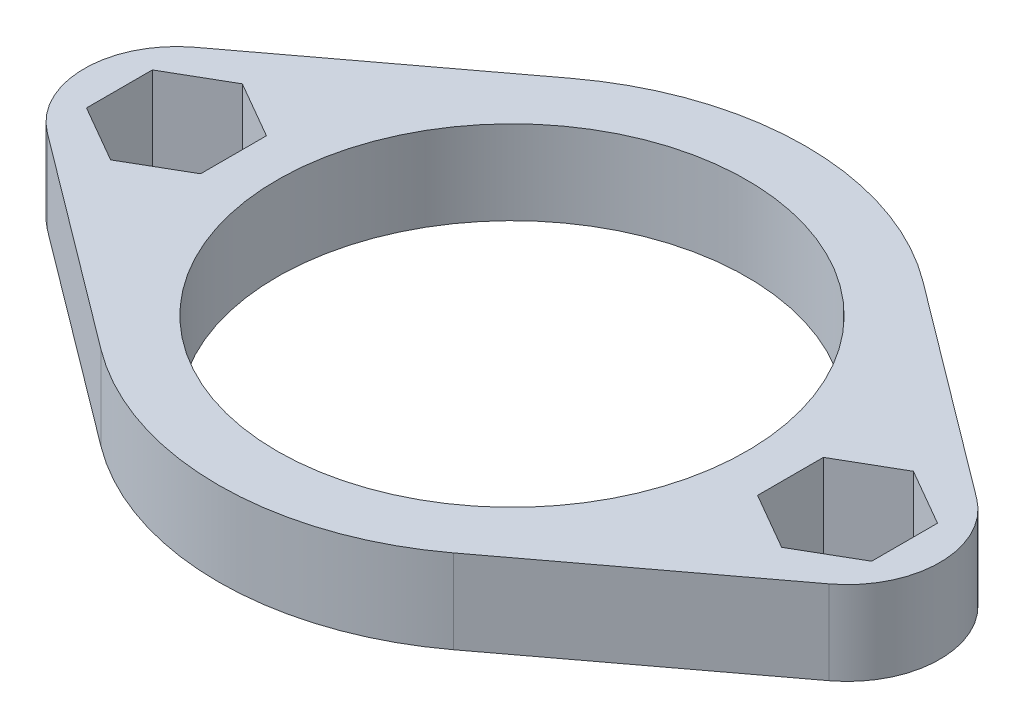
ISO-10303-21;
HEADER;
FILE_DESCRIPTION(('STEP AP214'),'2;1');
FILE_NAME('part.step','',(''),(''),'','','');
FILE_SCHEMA(('AUTOMOTIVE_DESIGN { 1 0 10303 214 1 1 1 1 }'));
ENDSEC;
DATA;
#1=APPLICATION_CONTEXT('core data for automotive mechanical design processes');
#2=APPLICATION_PROTOCOL_DEFINITION('international standard','automotive_design',2000,#1);
#3=PRODUCT_CONTEXT('',#1,'mechanical');
#4=PRODUCT('Part','Part','',(#3));
#5=PRODUCT_RELATED_PRODUCT_CATEGORY('part','',(#4));
#6=PRODUCT_DEFINITION_FORMATION('','',#4);
#7=PRODUCT_DEFINITION_CONTEXT('part definition',#1,'design');
#8=PRODUCT_DEFINITION('design','',#6,#7);
#9=PRODUCT_DEFINITION_SHAPE('','',#8);
#10=(LENGTH_UNIT() NAMED_UNIT(*) SI_UNIT(.MILLI.,.METRE.));
#11=(NAMED_UNIT(*) PLANE_ANGLE_UNIT() SI_UNIT($,.RADIAN.));
#12=(NAMED_UNIT(*) SI_UNIT($,.STERADIAN.) SOLID_ANGLE_UNIT());
#13=UNCERTAINTY_MEASURE_WITH_UNIT(LENGTH_MEASURE(1.E-05),#10,'distance_accuracy_value','');
#14=(GEOMETRIC_REPRESENTATION_CONTEXT(3) GLOBAL_UNCERTAINTY_ASSIGNED_CONTEXT((#13)) GLOBAL_UNIT_ASSIGNED_CONTEXT((#10,
#11,#12)) REPRESENTATION_CONTEXT('',''));
#15=CARTESIAN_POINT('',(0.,0.,0.));
#16=DIRECTION('',(0.,0.,1.));
#17=DIRECTION('',(1.,0.,0.));
#18=AXIS2_PLACEMENT_3D('',#15,#16,#17);
#19=CARTESIAN_POINT('',(-20.,5.,0.));
#20=DIRECTION('',(0.,1.,0.));
#21=DIRECTION('',(0.,0.,1.));
#22=AXIS2_PLACEMENT_3D('',#19,#20,#21);
#23=PLANE('',#22);
#24=DIRECTION('',(-0.866025403784439,0.,0.5));
#25=VECTOR('',#24,1.);
#26=CARTESIAN_POINT('',(-20.,5.,-3.92598183048946));
#27=LINE('',#26,#25);
#28=CARTESIAN_POINT('',(-20.,5.,-3.92598183048946));
#29=VERTEX_POINT('',#28);
#30=CARTESIAN_POINT('',(-23.4,5.,-1.96299091524473));
#31=VERTEX_POINT('',#30);
#32=EDGE_CURVE('E231',#29,#31,#27,.T.);
#33=ORIENTED_EDGE('',*,*,#32,.F.);
#34=DIRECTION('',(-0.866025403784439,0.,-0.5));
#35=VECTOR('',#34,1.);
#36=CARTESIAN_POINT('',(-16.6,5.,-1.96299091524473));
#37=LINE('',#36,#35);
#38=CARTESIAN_POINT('',(-16.6,5.,-1.96299091524473));
#39=VERTEX_POINT('',#38);
#40=EDGE_CURVE('E229',#39,#29,#37,.T.);
#41=ORIENTED_EDGE('',*,*,#40,.F.);
#42=DIRECTION('',(0.,0.,-1.));
#43=VECTOR('',#42,1.);
#44=CARTESIAN_POINT('',(-16.6,5.,1.96299091524473));
#45=LINE('',#44,#43);
#46=CARTESIAN_POINT('',(-16.6,5.,1.96299091524473));
#47=VERTEX_POINT('',#46);
#48=EDGE_CURVE('E241',#47,#39,#45,.T.);
#49=ORIENTED_EDGE('',*,*,#48,.F.);
#50=DIRECTION('',(0.866025403784439,0.,-0.5));
#51=VECTOR('',#50,1.);
#52=CARTESIAN_POINT('',(-20.,5.,3.92598183048945));
#53=LINE('',#52,#51);
#54=CARTESIAN_POINT('',(-20.,5.,3.92598183048945));
#55=VERTEX_POINT('',#54);
#56=EDGE_CURVE('E238',#55,#47,#53,.T.);
#57=ORIENTED_EDGE('',*,*,#56,.F.);
#58=DIRECTION('',(0.866025403784439,0.,0.5));
#59=VECTOR('',#58,1.);
#60=CARTESIAN_POINT('',(-23.4,5.,1.96299091524472));
#61=LINE('',#60,#59);
#62=CARTESIAN_POINT('',(-23.4,5.,1.96299091524472));
#63=VERTEX_POINT('',#62);
#64=EDGE_CURVE('E236',#63,#55,#61,.T.);
#65=ORIENTED_EDGE('',*,*,#64,.F.);
#66=DIRECTION('',(0.,0.,1.));
#67=VECTOR('',#66,1.);
#68=CARTESIAN_POINT('',(-23.4,5.,-1.96299091524473));
#69=LINE('',#68,#67);
#70=EDGE_CURVE('E234',#31,#63,#69,.T.);
#71=ORIENTED_EDGE('',*,*,#70,.F.);
#72=EDGE_LOOP('',(#33,#41,#49,#57,#65,#71));
#73=FACE_BOUND('',#72,.T.);
#74=CARTESIAN_POINT('',(-20.,5.,0.));
#75=DIRECTION('',(0.,1.,0.));
#76=DIRECTION('',(0.,0.,1.));
#77=AXIS2_PLACEMENT_3D('',#74,#75,#76);
#78=CIRCLE('',#77,5.50000000000002);
#79=CARTESIAN_POINT('',(-23.3,5.,-4.40000000000002));
#80=VERTEX_POINT('',#79);
#81=CARTESIAN_POINT('',(-23.3,5.,4.40000000000002));
#82=VERTEX_POINT('',#81);
#83=EDGE_CURVE('E274',#80,#82,#78,.T.);
#84=ORIENTED_EDGE('',*,*,#83,.T.);
#85=DIRECTION('',(0.8,0.,0.599999999999999));
#86=VECTOR('',#85,1.);
#87=CARTESIAN_POINT('',(-23.3,5.,4.40000000000002));
#88=LINE('',#87,#86);
#89=CARTESIAN_POINT('',(-10.5,5.,14.));
#90=VERTEX_POINT('',#89);
#91=EDGE_CURVE('E277',#82,#90,#88,.T.);
#92=ORIENTED_EDGE('',*,*,#91,.T.);
#93=CARTESIAN_POINT('',(0.,5.,0.));
#94=DIRECTION('',(0.,1.,0.));
#95=DIRECTION('',(0.,0.,1.));
#96=AXIS2_PLACEMENT_3D('',#93,#94,#95);
#97=CIRCLE('',#96,17.5);
#98=CARTESIAN_POINT('',(10.5,5.,14.));
#99=VERTEX_POINT('',#98);
#100=EDGE_CURVE('E280',#90,#99,#97,.T.);
#101=ORIENTED_EDGE('',*,*,#100,.T.);
#102=DIRECTION('',(0.8,0.,-0.599999999999999));
#103=VECTOR('',#102,1.);
#104=CARTESIAN_POINT('',(23.3,5.,4.40000000000002));
#105=LINE('',#104,#103);
#106=CARTESIAN_POINT('',(23.3,5.,4.40000000000002));
#107=VERTEX_POINT('',#106);
#108=EDGE_CURVE('E282',#99,#107,#105,.T.);
#109=ORIENTED_EDGE('',*,*,#108,.T.);
#110=CARTESIAN_POINT('',(20.,5.,0.));
#111=DIRECTION('',(0.,1.,0.));
#112=DIRECTION('',(0.,0.,-1.));
#113=AXIS2_PLACEMENT_3D('',#110,#111,#112);
#114=CIRCLE('',#113,5.50000000000002);
#115=CARTESIAN_POINT('',(23.3,5.,-4.40000000000002));
#116=VERTEX_POINT('',#115);
#117=EDGE_CURVE('E284',#107,#116,#114,.T.);
#118=ORIENTED_EDGE('',*,*,#117,.T.);
#119=DIRECTION('',(-0.8,0.,-0.599999999999999));
#120=VECTOR('',#119,1.);
#121=CARTESIAN_POINT('',(23.3,5.,-4.40000000000002));
#122=LINE('',#121,#120);
#123=CARTESIAN_POINT('',(10.5,5.,-14.));
#124=VERTEX_POINT('',#123);
#125=EDGE_CURVE('E286',#116,#124,#122,.T.);
#126=ORIENTED_EDGE('',*,*,#125,.T.);
#127=CARTESIAN_POINT('',(0.,5.,0.));
#128=DIRECTION('',(0.,1.,0.));
#129=DIRECTION('',(0.,0.,1.));
#130=AXIS2_PLACEMENT_3D('',#127,#128,#129);
#131=CIRCLE('',#130,17.5);
#132=CARTESIAN_POINT('',(-10.5,5.,-14.));
#133=VERTEX_POINT('',#132);
#134=EDGE_CURVE('E288',#124,#133,#131,.T.);
#135=ORIENTED_EDGE('',*,*,#134,.T.);
#136=DIRECTION('',(-0.8,0.,0.599999999999999));
#137=VECTOR('',#136,1.);
#138=CARTESIAN_POINT('',(-23.3,5.,-4.40000000000002));
#139=LINE('',#138,#137);
#140=EDGE_CURVE('E290',#133,#80,#139,.T.);
#141=ORIENTED_EDGE('',*,*,#140,.T.);
#142=EDGE_LOOP('',(#84,#92,#101,#109,#118,#126,#135,#141));
#143=FACE_BOUND('',#142,.T.);
#144=CARTESIAN_POINT('',(0.,5.,0.));
#145=DIRECTION('',(0.,1.,0.));
#146=DIRECTION('',(0.,0.,1.));
#147=AXIS2_PLACEMENT_3D('',#144,#145,#146);
#148=CIRCLE('',#147,14.);
#149=CARTESIAN_POINT('',(0.,5.,14.));
#150=VERTEX_POINT('',#149);
#151=EDGE_CURVE('E223',#150,#150,#148,.T.);
#152=ORIENTED_EDGE('',*,*,#151,.F.);
#153=EDGE_LOOP('',(#152));
#154=FACE_BOUND('',#153,.T.);
#155=DIRECTION('',(0.866025403784438,0.,-0.5));
#156=VECTOR('',#155,1.);
#157=CARTESIAN_POINT('',(20.,5.,3.92598183048946));
#158=LINE('',#157,#156);
#159=CARTESIAN_POINT('',(20.,5.,3.92598183048946));
#160=VERTEX_POINT('',#159);
#161=CARTESIAN_POINT('',(23.4,5.,1.96299091524472));
#162=VERTEX_POINT('',#161);
#163=EDGE_CURVE('E180',#160,#162,#158,.T.);
#164=ORIENTED_EDGE('',*,*,#163,.F.);
#165=DIRECTION('',(0.866025403784439,0.,0.5));
#166=VECTOR('',#165,1.);
#167=CARTESIAN_POINT('',(16.6,5.,1.96299091524475));
#168=LINE('',#167,#166);
#169=CARTESIAN_POINT('',(16.6,5.,1.96299091524475));
#170=VERTEX_POINT('',#169);
#171=EDGE_CURVE('E172',#170,#160,#168,.T.);
#172=ORIENTED_EDGE('',*,*,#171,.F.);
#173=DIRECTION('',(0.,0.,1.));
#174=VECTOR('',#173,1.);
#175=CARTESIAN_POINT('',(16.6,5.,-1.9629909152447));
#176=LINE('',#175,#174);
#177=CARTESIAN_POINT('',(16.6,5.,-1.9629909152447));
#178=VERTEX_POINT('',#177);
#179=EDGE_CURVE('E201',#178,#170,#176,.T.);
#180=ORIENTED_EDGE('',*,*,#179,.F.);
#181=DIRECTION('',(-0.866025403784435,0.,0.500000000000007));
#182=VECTOR('',#181,1.);
#183=CARTESIAN_POINT('',(20.,5.,-3.92598183048946));
#184=LINE('',#183,#182);
#185=CARTESIAN_POINT('',(20.,5.,-3.92598183048946));
#186=VERTEX_POINT('',#185);
#187=EDGE_CURVE('E199',#186,#178,#184,.T.);
#188=ORIENTED_EDGE('',*,*,#187,.F.);
#189=DIRECTION('',(-0.866025403784439,0.,-0.5));
#190=VECTOR('',#189,1.);
#191=CARTESIAN_POINT('',(23.4,5.,-1.96299091524473));
#192=LINE('',#191,#190);
#193=CARTESIAN_POINT('',(23.4,5.,-1.96299091524473));
#194=VERTEX_POINT('',#193);
#195=EDGE_CURVE('E195',#194,#186,#192,.T.);
#196=ORIENTED_EDGE('',*,*,#195,.F.);
#197=DIRECTION('',(0.,0.,-1.));
#198=VECTOR('',#197,1.);
#199=CARTESIAN_POINT('',(23.4,5.,1.96299091524472));
#200=LINE('',#199,#198);
#201=EDGE_CURVE('E193',#162,#194,#200,.T.);
#202=ORIENTED_EDGE('',*,*,#201,.F.);
#203=EDGE_LOOP('',(#164,#172,#180,#188,#196,#202));
#204=FACE_BOUND('',#203,.T.);
#205=ADVANCED_FACE('F35',(#73,#143,#154,#204),#23,.T.);
#206=CARTESIAN_POINT('',(-20.,0.,0.));
#207=DIRECTION('',(0.,1.,0.));
#208=DIRECTION('',(0.,0.,1.));
#209=AXIS2_PLACEMENT_3D('',#206,#207,#208);
#210=PLANE('',#209);
#211=CARTESIAN_POINT('',(0.,0.,0.));
#212=DIRECTION('',(0.,1.,0.));
#213=DIRECTION('',(0.,0.,1.));
#214=AXIS2_PLACEMENT_3D('',#211,#212,#213);
#215=CIRCLE('',#214,14.);
#216=CARTESIAN_POINT('',(0.,0.,14.));
#217=VERTEX_POINT('',#216);
#218=EDGE_CURVE('E188',#217,#217,#215,.T.);
#219=ORIENTED_EDGE('',*,*,#218,.T.);
#220=EDGE_LOOP('',(#219));
#221=FACE_BOUND('',#220,.T.);
#222=DIRECTION('',(-0.866025403784439,0.,-0.5));
#223=VECTOR('',#222,1.);
#224=CARTESIAN_POINT('',(-16.6,0.,-1.96299091524473));
#225=LINE('',#224,#223);
#226=CARTESIAN_POINT('',(-16.6,0.,-1.96299091524473));
#227=VERTEX_POINT('',#226);
#228=CARTESIAN_POINT('',(-20.,0.,-3.92598183048946));
#229=VERTEX_POINT('',#228);
#230=EDGE_CURVE('E226',#227,#229,#225,.T.);
#231=ORIENTED_EDGE('',*,*,#230,.T.);
#232=DIRECTION('',(-0.866025403784439,0.,0.5));
#233=VECTOR('',#232,1.);
#234=CARTESIAN_POINT('',(-20.,0.,-3.92598183048946));
#235=LINE('',#234,#233);
#236=CARTESIAN_POINT('',(-23.4,0.,-1.96299091524473));
#237=VERTEX_POINT('',#236);
#238=EDGE_CURVE('E246',#229,#237,#235,.T.);
#239=ORIENTED_EDGE('',*,*,#238,.T.);
#240=DIRECTION('',(0.,0.,1.));
#241=VECTOR('',#240,1.);
#242=CARTESIAN_POINT('',(-23.4,0.,-1.96299091524473));
#243=LINE('',#242,#241);
#244=CARTESIAN_POINT('',(-23.4,0.,1.96299091524472));
#245=VERTEX_POINT('',#244);
#246=EDGE_CURVE('E249',#237,#245,#243,.T.);
#247=ORIENTED_EDGE('',*,*,#246,.T.);
#248=DIRECTION('',(0.866025403784439,0.,0.5));
#249=VECTOR('',#248,1.);
#250=CARTESIAN_POINT('',(-23.4,0.,1.96299091524472));
#251=LINE('',#250,#249);
#252=CARTESIAN_POINT('',(-20.,0.,3.92598183048945));
#253=VERTEX_POINT('',#252);
#254=EDGE_CURVE('E252',#245,#253,#251,.T.);
#255=ORIENTED_EDGE('',*,*,#254,.T.);
#256=DIRECTION('',(0.866025403784439,0.,-0.5));
#257=VECTOR('',#256,1.);
#258=CARTESIAN_POINT('',(-20.,0.,3.92598183048945));
#259=LINE('',#258,#257);
#260=CARTESIAN_POINT('',(-16.6,0.,1.96299091524473));
#261=VERTEX_POINT('',#260);
#262=EDGE_CURVE('E255',#253,#261,#259,.T.);
#263=ORIENTED_EDGE('',*,*,#262,.T.);
#264=DIRECTION('',(0.,0.,-1.));
#265=VECTOR('',#264,1.);
#266=CARTESIAN_POINT('',(-16.6,0.,1.96299091524473));
#267=LINE('',#266,#265);
#268=EDGE_CURVE('E232',#261,#227,#267,.T.);
#269=ORIENTED_EDGE('',*,*,#268,.T.);
#270=EDGE_LOOP('',(#231,#239,#247,#255,#263,#269));
#271=FACE_BOUND('',#270,.T.);
#272=CARTESIAN_POINT('',(-20.,0.,0.));
#273=DIRECTION('',(0.,1.,0.));
#274=DIRECTION('',(0.,0.,1.));
#275=AXIS2_PLACEMENT_3D('',#272,#273,#274);
#276=CIRCLE('',#275,5.50000000000002);
#277=CARTESIAN_POINT('',(-23.3,0.,-4.40000000000002));
#278=VERTEX_POINT('',#277);
#279=CARTESIAN_POINT('',(-23.3,0.,4.40000000000002));
#280=VERTEX_POINT('',#279);
#281=EDGE_CURVE('E273',#278,#280,#276,.T.);
#282=ORIENTED_EDGE('',*,*,#281,.F.);
#283=DIRECTION('',(-0.8,0.,0.599999999999999));
#284=VECTOR('',#283,1.);
#285=CARTESIAN_POINT('',(-23.3,0.,-4.40000000000002));
#286=LINE('',#285,#284);
#287=CARTESIAN_POINT('',(-10.5,0.,-14.));
#288=VERTEX_POINT('',#287);
#289=EDGE_CURVE('E278',#288,#278,#286,.T.);
#290=ORIENTED_EDGE('',*,*,#289,.F.);
#291=CARTESIAN_POINT('',(0.,0.,0.));
#292=DIRECTION('',(0.,1.,0.));
#293=DIRECTION('',(0.,0.,1.));
#294=AXIS2_PLACEMENT_3D('',#291,#292,#293);
#295=CIRCLE('',#294,17.5);
#296=CARTESIAN_POINT('',(10.5,0.,-14.));
#297=VERTEX_POINT('',#296);
#298=EDGE_CURVE('E305',#297,#288,#295,.T.);
#299=ORIENTED_EDGE('',*,*,#298,.F.);
#300=DIRECTION('',(-0.8,0.,-0.599999999999999));
#301=VECTOR('',#300,1.);
#302=CARTESIAN_POINT('',(23.3,0.,-4.40000000000002));
#303=LINE('',#302,#301);
#304=CARTESIAN_POINT('',(23.3,0.,-4.40000000000002));
#305=VERTEX_POINT('',#304);
#306=EDGE_CURVE('E303',#305,#297,#303,.T.);
#307=ORIENTED_EDGE('',*,*,#306,.F.);
#308=CARTESIAN_POINT('',(20.,0.,0.));
#309=DIRECTION('',(0.,1.,0.));
#310=DIRECTION('',(0.,0.,-1.));
#311=AXIS2_PLACEMENT_3D('',#308,#309,#310);
#312=CIRCLE('',#311,5.50000000000002);
#313=CARTESIAN_POINT('',(23.3,0.,4.40000000000002));
#314=VERTEX_POINT('',#313);
#315=EDGE_CURVE('E301',#314,#305,#312,.T.);
#316=ORIENTED_EDGE('',*,*,#315,.F.);
#317=DIRECTION('',(0.8,0.,-0.599999999999999));
#318=VECTOR('',#317,1.);
#319=CARTESIAN_POINT('',(23.3,0.,4.40000000000002));
#320=LINE('',#319,#318);
#321=CARTESIAN_POINT('',(10.5,0.,14.));
#322=VERTEX_POINT('',#321);
#323=EDGE_CURVE('E299',#322,#314,#320,.T.);
#324=ORIENTED_EDGE('',*,*,#323,.F.);
#325=CARTESIAN_POINT('',(0.,0.,0.));
#326=DIRECTION('',(0.,1.,0.));
#327=DIRECTION('',(0.,0.,1.));
#328=AXIS2_PLACEMENT_3D('',#325,#326,#327);
#329=CIRCLE('',#328,17.5);
#330=CARTESIAN_POINT('',(-10.5,0.,14.));
#331=VERTEX_POINT('',#330);
#332=EDGE_CURVE('E297',#331,#322,#329,.T.);
#333=ORIENTED_EDGE('',*,*,#332,.F.);
#334=DIRECTION('',(0.8,0.,0.599999999999999));
#335=VECTOR('',#334,1.);
#336=CARTESIAN_POINT('',(-23.3,0.,4.40000000000002));
#337=LINE('',#336,#335);
#338=EDGE_CURVE('E295',#280,#331,#337,.T.);
#339=ORIENTED_EDGE('',*,*,#338,.F.);
#340=EDGE_LOOP('',(#282,#290,#299,#307,#316,#324,#333,#339));
#341=FACE_BOUND('',#340,.T.);
#342=DIRECTION('',(0.866025403784439,0.,0.5));
#343=VECTOR('',#342,1.);
#344=CARTESIAN_POINT('',(16.6,0.,1.96299091524475));
#345=LINE('',#344,#343);
#346=CARTESIAN_POINT('',(16.6,0.,1.96299091524475));
#347=VERTEX_POINT('',#346);
#348=CARTESIAN_POINT('',(20.,0.,3.92598183048946));
#349=VERTEX_POINT('',#348);
#350=EDGE_CURVE('E58',#347,#349,#345,.T.);
#351=ORIENTED_EDGE('',*,*,#350,.T.);
#352=DIRECTION('',(0.866025403784438,0.,-0.5));
#353=VECTOR('',#352,1.);
#354=CARTESIAN_POINT('',(20.,0.,3.92598183048946));
#355=LINE('',#354,#353);
#356=CARTESIAN_POINT('',(23.4,0.,1.96299091524472));
#357=VERTEX_POINT('',#356);
#358=EDGE_CURVE('E187',#349,#357,#355,.T.);
#359=ORIENTED_EDGE('',*,*,#358,.T.);
#360=DIRECTION('',(0.,0.,-1.));
#361=VECTOR('',#360,1.);
#362=CARTESIAN_POINT('',(23.4,0.,1.96299091524472));
#363=LINE('',#362,#361);
#364=CARTESIAN_POINT('',(23.4,0.,-1.96299091524473));
#365=VERTEX_POINT('',#364);
#366=EDGE_CURVE('E205',#357,#365,#363,.T.);
#367=ORIENTED_EDGE('',*,*,#366,.T.);
#368=DIRECTION('',(-0.866025403784439,0.,-0.5));
#369=VECTOR('',#368,1.);
#370=CARTESIAN_POINT('',(23.4,0.,-1.96299091524473));
#371=LINE('',#370,#369);
#372=CARTESIAN_POINT('',(20.,0.,-3.92598183048946));
#373=VERTEX_POINT('',#372);
#374=EDGE_CURVE('E208',#365,#373,#371,.T.);
#375=ORIENTED_EDGE('',*,*,#374,.T.);
#376=DIRECTION('',(-0.866025403784435,0.,0.500000000000007));
#377=VECTOR('',#376,1.);
#378=CARTESIAN_POINT('',(20.,0.,-3.92598183048946));
#379=LINE('',#378,#377);
#380=CARTESIAN_POINT('',(16.6,0.,-1.9629909152447));
#381=VERTEX_POINT('',#380);
#382=EDGE_CURVE('E211',#373,#381,#379,.T.);
#383=ORIENTED_EDGE('',*,*,#382,.T.);
#384=DIRECTION('',(0.,0.,1.));
#385=VECTOR('',#384,1.);
#386=CARTESIAN_POINT('',(16.6,0.,-1.9629909152447));
#387=LINE('',#386,#385);
#388=EDGE_CURVE('E181',#381,#347,#387,.T.);
#389=ORIENTED_EDGE('',*,*,#388,.T.);
#390=EDGE_LOOP('',(#351,#359,#367,#375,#383,#389));
#391=FACE_BOUND('',#390,.T.);
#392=ADVANCED_FACE('F335',(#221,#271,#341,#391),#210,.F.);
#393=CARTESIAN_POINT('',(-20.,5.,0.));
#394=DIRECTION('',(0.,-1.,0.));
#395=DIRECTION('',(0.,0.,-1.));
#396=AXIS2_PLACEMENT_3D('',#393,#394,#395);
#397=CYLINDRICAL_SURFACE('',#396,5.50000000000002);
#398=ORIENTED_EDGE('',*,*,#281,.T.);
#399=DIRECTION('',(0.,-1.,0.));
#400=VECTOR('',#399,1.);
#401=CARTESIAN_POINT('',(-23.3,5.,4.40000000000002));
#402=LINE('',#401,#400);
#403=EDGE_CURVE('E11',#82,#280,#402,.T.);
#404=ORIENTED_EDGE('',*,*,#403,.F.);
#405=ORIENTED_EDGE('',*,*,#83,.F.);
#406=DIRECTION('',(0.,-1.,0.));
#407=VECTOR('',#406,1.);
#408=CARTESIAN_POINT('',(-23.3,5.,-4.40000000000002));
#409=LINE('',#408,#407);
#410=EDGE_CURVE('E292',#80,#278,#409,.T.);
#411=ORIENTED_EDGE('',*,*,#410,.T.);
#412=EDGE_LOOP('',(#398,#404,#405,#411));
#413=FACE_BOUND('',#412,.T.);
#414=ADVANCED_FACE('F37',(#413),#397,.T.);
#415=CARTESIAN_POINT('',(-23.3,5.,4.40000000000002));
#416=DIRECTION('',(0.599999999999999,0.,-0.8));
#417=DIRECTION('',(-0.800000000000001,0.,-0.599999999999999));
#418=AXIS2_PLACEMENT_3D('',#415,#416,#417);
#419=PLANE('',#418);
#420=ORIENTED_EDGE('',*,*,#338,.T.);
#421=DIRECTION('',(0.,-1.,0.));
#422=VECTOR('',#421,1.);
#423=CARTESIAN_POINT('',(-10.5,5.,14.));
#424=LINE('',#423,#422);
#425=EDGE_CURVE('E43',#90,#331,#424,.T.);
#426=ORIENTED_EDGE('',*,*,#425,.F.);
#427=ORIENTED_EDGE('',*,*,#91,.F.);
#428=ORIENTED_EDGE('',*,*,#403,.T.);
#429=EDGE_LOOP('',(#420,#426,#427,#428));
#430=FACE_BOUND('',#429,.T.);
#431=ADVANCED_FACE('F353',(#430),#419,.F.);
#432=CARTESIAN_POINT('',(0.,5.,0.));
#433=DIRECTION('',(0.,-1.,0.));
#434=DIRECTION('',(0.,0.,-1.));
#435=AXIS2_PLACEMENT_3D('',#432,#433,#434);
#436=CYLINDRICAL_SURFACE('',#435,17.5);
#437=ORIENTED_EDGE('',*,*,#332,.T.);
#438=DIRECTION('',(0.,-1.,0.));
#439=VECTOR('',#438,1.);
#440=CARTESIAN_POINT('',(10.5,5.,14.));
#441=LINE('',#440,#439);
#442=EDGE_CURVE('E322',#99,#322,#441,.T.);
#443=ORIENTED_EDGE('',*,*,#442,.F.);
#444=ORIENTED_EDGE('',*,*,#100,.F.);
#445=ORIENTED_EDGE('',*,*,#425,.T.);
#446=EDGE_LOOP('',(#437,#443,#444,#445));
#447=FACE_BOUND('',#446,.T.);
#448=ADVANCED_FACE('F329',(#447),#436,.T.);
#449=CARTESIAN_POINT('',(23.3,5.,4.40000000000002));
#450=DIRECTION('',(-0.599999999999999,0.,-0.8));
#451=DIRECTION('',(-0.800000000000001,0.,0.599999999999999));
#452=AXIS2_PLACEMENT_3D('',#449,#450,#451);
#453=PLANE('',#452);
#454=ORIENTED_EDGE('',*,*,#323,.T.);
#455=DIRECTION('',(0.,-1.,0.));
#456=VECTOR('',#455,1.);
#457=CARTESIAN_POINT('',(23.3,5.,4.40000000000002));
#458=LINE('',#457,#456);
#459=EDGE_CURVE('E319',#107,#314,#458,.T.);
#460=ORIENTED_EDGE('',*,*,#459,.F.);
#461=ORIENTED_EDGE('',*,*,#108,.F.);
#462=ORIENTED_EDGE('',*,*,#442,.T.);
#463=EDGE_LOOP('',(#454,#460,#461,#462));
#464=FACE_BOUND('',#463,.T.);
#465=ADVANCED_FACE('F341',(#464),#453,.F.);
#466=CARTESIAN_POINT('',(20.,5.,0.));
#467=DIRECTION('',(0.,-1.,0.));
#468=DIRECTION('',(0.,0.,-1.));
#469=AXIS2_PLACEMENT_3D('',#466,#467,#468);
#470=CYLINDRICAL_SURFACE('',#469,5.50000000000002);
#471=ORIENTED_EDGE('',*,*,#315,.T.);
#472=DIRECTION('',(0.,-1.,0.));
#473=VECTOR('',#472,1.);
#474=CARTESIAN_POINT('',(23.3,5.,-4.40000000000002));
#475=LINE('',#474,#473);
#476=EDGE_CURVE('E316',#116,#305,#475,.T.);
#477=ORIENTED_EDGE('',*,*,#476,.F.);
#478=ORIENTED_EDGE('',*,*,#117,.F.);
#479=ORIENTED_EDGE('',*,*,#459,.T.);
#480=EDGE_LOOP('',(#471,#477,#478,#479));
#481=FACE_BOUND('',#480,.T.);
#482=ADVANCED_FACE('F345',(#481),#470,.T.);
#483=CARTESIAN_POINT('',(23.3,5.,-4.40000000000002));
#484=DIRECTION('',(-0.599999999999999,0.,0.8));
#485=DIRECTION('',(0.800000000000001,0.,0.599999999999999));
#486=AXIS2_PLACEMENT_3D('',#483,#484,#485);
#487=PLANE('',#486);
#488=ORIENTED_EDGE('',*,*,#306,.T.);
#489=DIRECTION('',(0.,-1.,0.));
#490=VECTOR('',#489,1.);
#491=CARTESIAN_POINT('',(10.5,5.,-14.));
#492=LINE('',#491,#490);
#493=EDGE_CURVE('E313',#124,#297,#492,.T.);
#494=ORIENTED_EDGE('',*,*,#493,.F.);
#495=ORIENTED_EDGE('',*,*,#125,.F.);
#496=ORIENTED_EDGE('',*,*,#476,.T.);
#497=EDGE_LOOP('',(#488,#494,#495,#496));
#498=FACE_BOUND('',#497,.T.);
#499=ADVANCED_FACE('F366',(#498),#487,.F.);
#500=CARTESIAN_POINT('',(0.,5.,0.));
#501=DIRECTION('',(0.,-1.,0.));
#502=DIRECTION('',(0.,0.,-1.));
#503=AXIS2_PLACEMENT_3D('',#500,#501,#502);
#504=CYLINDRICAL_SURFACE('',#503,17.5);
#505=ORIENTED_EDGE('',*,*,#298,.T.);
#506=DIRECTION('',(0.,-1.,0.));
#507=VECTOR('',#506,1.);
#508=CARTESIAN_POINT('',(-10.5,5.,-14.));
#509=LINE('',#508,#507);
#510=EDGE_CURVE('E310',#133,#288,#509,.T.);
#511=ORIENTED_EDGE('',*,*,#510,.F.);
#512=ORIENTED_EDGE('',*,*,#134,.F.);
#513=ORIENTED_EDGE('',*,*,#493,.T.);
#514=EDGE_LOOP('',(#505,#511,#512,#513));
#515=FACE_BOUND('',#514,.T.);
#516=ADVANCED_FACE('F364',(#515),#504,.T.);
#517=CARTESIAN_POINT('',(-23.3,5.,-4.40000000000002));
#518=DIRECTION('',(0.599999999999999,0.,0.8));
#519=DIRECTION('',(0.800000000000001,0.,-0.599999999999999));
#520=AXIS2_PLACEMENT_3D('',#517,#518,#519);
#521=PLANE('',#520);
#522=ORIENTED_EDGE('',*,*,#289,.T.);
#523=ORIENTED_EDGE('',*,*,#410,.F.);
#524=ORIENTED_EDGE('',*,*,#140,.F.);
#525=ORIENTED_EDGE('',*,*,#510,.T.);
#526=EDGE_LOOP('',(#522,#523,#524,#525));
#527=FACE_BOUND('',#526,.T.);
#528=ADVANCED_FACE('F359',(#527),#521,.F.);
#529=CARTESIAN_POINT('',(-16.6,5.,-1.96299091524473));
#530=DIRECTION('',(-0.5,0.,0.866025403784438));
#531=DIRECTION('',(0.866025403784439,0.,0.5));
#532=AXIS2_PLACEMENT_3D('',#529,#530,#531);
#533=PLANE('',#532);
#534=ORIENTED_EDGE('',*,*,#230,.F.);
#535=DIRECTION('',(0.,-1.,0.));
#536=VECTOR('',#535,1.);
#537=CARTESIAN_POINT('',(-16.6,5.,-1.96299091524473));
#538=LINE('',#537,#536);
#539=EDGE_CURVE('E243',#39,#227,#538,.T.);
#540=ORIENTED_EDGE('',*,*,#539,.F.);
#541=ORIENTED_EDGE('',*,*,#40,.T.);
#542=DIRECTION('',(0.,-1.,0.));
#543=VECTOR('',#542,1.);
#544=CARTESIAN_POINT('',(-20.,5.,-3.92598183048946));
#545=LINE('',#544,#543);
#546=EDGE_CURVE('E270',#29,#229,#545,.T.);
#547=ORIENTED_EDGE('',*,*,#546,.T.);
#548=EDGE_LOOP('',(#534,#540,#541,#547));
#549=FACE_BOUND('',#548,.T.);
#550=ADVANCED_FACE('F385',(#549),#533,.T.);
#551=CARTESIAN_POINT('',(-20.,5.,-3.92598183048946));
#552=DIRECTION('',(0.5,0.,0.866025403784439));
#553=DIRECTION('',(0.866025403784439,0.,-0.5));
#554=AXIS2_PLACEMENT_3D('',#551,#552,#553);
#555=PLANE('',#554);
#556=ORIENTED_EDGE('',*,*,#238,.F.);
#557=ORIENTED_EDGE('',*,*,#546,.F.);
#558=ORIENTED_EDGE('',*,*,#32,.T.);
#559=DIRECTION('',(0.,-1.,0.));
#560=VECTOR('',#559,1.);
#561=CARTESIAN_POINT('',(-23.4,5.,-1.96299091524473));
#562=LINE('',#561,#560);
#563=EDGE_CURVE('E268',#31,#237,#562,.T.);
#564=ORIENTED_EDGE('',*,*,#563,.T.);
#565=EDGE_LOOP('',(#556,#557,#558,#564));
#566=FACE_BOUND('',#565,.T.);
#567=ADVANCED_FACE('F392',(#566),#555,.T.);
#568=CARTESIAN_POINT('',(-23.4,5.,-1.96299091524473));
#569=DIRECTION('',(1.,0.,0.));
#570=DIRECTION('',(0.,0.,-1.));
#571=AXIS2_PLACEMENT_3D('',#568,#569,#570);
#572=PLANE('',#571);
#573=ORIENTED_EDGE('',*,*,#246,.F.);
#574=ORIENTED_EDGE('',*,*,#563,.F.);
#575=ORIENTED_EDGE('',*,*,#70,.T.);
#576=DIRECTION('',(0.,-1.,0.));
#577=VECTOR('',#576,1.);
#578=CARTESIAN_POINT('',(-23.4,5.,1.96299091524472));
#579=LINE('',#578,#577);
#580=EDGE_CURVE('E266',#63,#245,#579,.T.);
#581=ORIENTED_EDGE('',*,*,#580,.T.);
#582=EDGE_LOOP('',(#573,#574,#575,#581));
#583=FACE_BOUND('',#582,.T.);
#584=ADVANCED_FACE('F397',(#583),#572,.T.);
#585=CARTESIAN_POINT('',(-23.4,5.,1.96299091524472));
#586=DIRECTION('',(0.5,0.,-0.866025403784439));
#587=DIRECTION('',(-0.866025403784439,0.,-0.5));
#588=AXIS2_PLACEMENT_3D('',#585,#586,#587);
#589=PLANE('',#588);
#590=ORIENTED_EDGE('',*,*,#254,.F.);
#591=ORIENTED_EDGE('',*,*,#580,.F.);
#592=ORIENTED_EDGE('',*,*,#64,.T.);
#593=DIRECTION('',(0.,-1.,0.));
#594=VECTOR('',#593,1.);
#595=CARTESIAN_POINT('',(-20.,5.,3.92598183048945));
#596=LINE('',#595,#594);
#597=EDGE_CURVE('E264',#55,#253,#596,.T.);
#598=ORIENTED_EDGE('',*,*,#597,.T.);
#599=EDGE_LOOP('',(#590,#591,#592,#598));
#600=FACE_BOUND('',#599,.T.);
#601=ADVANCED_FACE('F420',(#600),#589,.T.);
#602=CARTESIAN_POINT('',(-20.,5.,3.92598183048945));
#603=DIRECTION('',(-0.5,0.,-0.866025403784439));
#604=DIRECTION('',(-0.866025403784439,0.,0.5));
#605=AXIS2_PLACEMENT_3D('',#602,#603,#604);
#606=PLANE('',#605);
#607=ORIENTED_EDGE('',*,*,#262,.F.);
#608=ORIENTED_EDGE('',*,*,#597,.F.);
#609=ORIENTED_EDGE('',*,*,#56,.T.);
#610=DIRECTION('',(0.,-1.,0.));
#611=VECTOR('',#610,1.);
#612=CARTESIAN_POINT('',(-16.6,5.,1.96299091524473));
#613=LINE('',#612,#611);
#614=EDGE_CURVE('E262',#47,#261,#613,.T.);
#615=ORIENTED_EDGE('',*,*,#614,.T.);
#616=EDGE_LOOP('',(#607,#608,#609,#615));
#617=FACE_BOUND('',#616,.T.);
#618=ADVANCED_FACE('F411',(#617),#606,.T.);
#619=CARTESIAN_POINT('',(-16.6,5.,1.96299091524473));
#620=DIRECTION('',(-1.,0.,0.));
#621=DIRECTION('',(0.,0.,1.));
#622=AXIS2_PLACEMENT_3D('',#619,#620,#621);
#623=PLANE('',#622);
#624=ORIENTED_EDGE('',*,*,#268,.F.);
#625=ORIENTED_EDGE('',*,*,#614,.F.);
#626=ORIENTED_EDGE('',*,*,#48,.T.);
#627=ORIENTED_EDGE('',*,*,#539,.T.);
#628=EDGE_LOOP('',(#624,#625,#626,#627));
#629=FACE_BOUND('',#628,.T.);
#630=ADVANCED_FACE('F405',(#629),#623,.T.);
#631=CARTESIAN_POINT('',(0.,5.,0.));
#632=DIRECTION('',(0.,-1.,0.));
#633=DIRECTION('',(0.,0.,-1.));
#634=AXIS2_PLACEMENT_3D('',#631,#632,#633);
#635=CYLINDRICAL_SURFACE('',#634,14.);
#636=ORIENTED_EDGE('',*,*,#151,.T.);
#637=EDGE_LOOP('',(#636));
#638=FACE_BOUND('',#637,.T.);
#639=ORIENTED_EDGE('',*,*,#218,.F.);
#640=EDGE_LOOP('',(#639));
#641=FACE_BOUND('',#640,.T.);
#642=ADVANCED_FACE('F432',(#638,#641),#635,.F.);
#643=CARTESIAN_POINT('',(16.6,5.,1.96299091524475));
#644=DIRECTION('',(0.5,0.,-0.866025403784439));
#645=DIRECTION('',(-0.866025403784439,0.,-0.5));
#646=AXIS2_PLACEMENT_3D('',#643,#644,#645);
#647=PLANE('',#646);
#648=ORIENTED_EDGE('',*,*,#350,.F.);
#649=DIRECTION('',(0.,-1.,0.));
#650=VECTOR('',#649,1.);
#651=CARTESIAN_POINT('',(16.6,5.,1.96299091524475));
#652=LINE('',#651,#650);
#653=EDGE_CURVE('E176',#170,#347,#652,.T.);
#654=ORIENTED_EDGE('',*,*,#653,.F.);
#655=ORIENTED_EDGE('',*,*,#171,.T.);
#656=DIRECTION('',(0.,-1.,0.));
#657=VECTOR('',#656,1.);
#658=CARTESIAN_POINT('',(20.,5.,3.92598183048946));
#659=LINE('',#658,#657);
#660=EDGE_CURVE('E175',#160,#349,#659,.T.);
#661=ORIENTED_EDGE('',*,*,#660,.T.);
#662=EDGE_LOOP('',(#648,#654,#655,#661));
#663=FACE_BOUND('',#662,.T.);
#664=ADVANCED_FACE('F174',(#663),#647,.T.);
#665=CARTESIAN_POINT('',(20.,5.,3.92598183048946));
#666=DIRECTION('',(-0.5,0.,-0.866025403784439));
#667=DIRECTION('',(-0.866025403784439,0.,0.5));
#668=AXIS2_PLACEMENT_3D('',#665,#666,#667);
#669=PLANE('',#668);
#670=ORIENTED_EDGE('',*,*,#358,.F.);
#671=ORIENTED_EDGE('',*,*,#660,.F.);
#672=ORIENTED_EDGE('',*,*,#163,.T.);
#673=DIRECTION('',(0.,-1.,0.));
#674=VECTOR('',#673,1.);
#675=CARTESIAN_POINT('',(23.4,5.,1.96299091524472));
#676=LINE('',#675,#674);
#677=EDGE_CURVE('E189',#162,#357,#676,.T.);
#678=ORIENTED_EDGE('',*,*,#677,.T.);
#679=EDGE_LOOP('',(#670,#671,#672,#678));
#680=FACE_BOUND('',#679,.T.);
#681=ADVANCED_FACE('F184',(#680),#669,.T.);
#682=CARTESIAN_POINT('',(23.4,5.,1.96299091524472));
#683=DIRECTION('',(-1.,0.,0.));
#684=DIRECTION('',(0.,0.,1.));
#685=AXIS2_PLACEMENT_3D('',#682,#683,#684);
#686=PLANE('',#685);
#687=ORIENTED_EDGE('',*,*,#366,.F.);
#688=ORIENTED_EDGE('',*,*,#677,.F.);
#689=ORIENTED_EDGE('',*,*,#201,.T.);
#690=DIRECTION('',(0.,-1.,0.));
#691=VECTOR('',#690,1.);
#692=CARTESIAN_POINT('',(23.4,5.,-1.96299091524473));
#693=LINE('',#692,#691);
#694=EDGE_CURVE('E220',#194,#365,#693,.T.);
#695=ORIENTED_EDGE('',*,*,#694,.T.);
#696=EDGE_LOOP('',(#687,#688,#689,#695));
#697=FACE_BOUND('',#696,.T.);
#698=ADVANCED_FACE('F440',(#697),#686,.T.);
#699=CARTESIAN_POINT('',(23.4,5.,-1.96299091524473));
#700=DIRECTION('',(-0.5,0.,0.866025403784439));
#701=DIRECTION('',(0.866025403784439,0.,0.5));
#702=AXIS2_PLACEMENT_3D('',#699,#700,#701);
#703=PLANE('',#702);
#704=ORIENTED_EDGE('',*,*,#374,.F.);
#705=ORIENTED_EDGE('',*,*,#694,.F.);
#706=ORIENTED_EDGE('',*,*,#195,.T.);
#707=DIRECTION('',(0.,-1.,0.));
#708=VECTOR('',#707,1.);
#709=CARTESIAN_POINT('',(20.,5.,-3.92598183048946));
#710=LINE('',#709,#708);
#711=EDGE_CURVE('E218',#186,#373,#710,.T.);
#712=ORIENTED_EDGE('',*,*,#711,.T.);
#713=EDGE_LOOP('',(#704,#705,#706,#712));
#714=FACE_BOUND('',#713,.T.);
#715=ADVANCED_FACE('F443',(#714),#703,.T.);
#716=CARTESIAN_POINT('',(20.,5.,-3.92598183048946));
#717=DIRECTION('',(0.500000000000007,0.,0.866025403784435));
#718=DIRECTION('',(0.866025403784435,0.,-0.500000000000007));
#719=AXIS2_PLACEMENT_3D('',#716,#717,#718);
#720=PLANE('',#719);
#721=ORIENTED_EDGE('',*,*,#382,.F.);
#722=ORIENTED_EDGE('',*,*,#711,.F.);
#723=ORIENTED_EDGE('',*,*,#187,.T.);
#724=DIRECTION('',(0.,-1.,0.));
#725=VECTOR('',#724,1.);
#726=CARTESIAN_POINT('',(16.6,5.,-1.9629909152447));
#727=LINE('',#726,#725);
#728=EDGE_CURVE('E50',#178,#381,#727,.T.);
#729=ORIENTED_EDGE('',*,*,#728,.T.);
#730=EDGE_LOOP('',(#721,#722,#723,#729));
#731=FACE_BOUND('',#730,.T.);
#732=ADVANCED_FACE('F447',(#731),#720,.T.);
#733=CARTESIAN_POINT('',(16.6,5.,-1.9629909152447));
#734=DIRECTION('',(1.,0.,0.));
#735=DIRECTION('',(0.,0.,-1.));
#736=AXIS2_PLACEMENT_3D('',#733,#734,#735);
#737=PLANE('',#736);
#738=ORIENTED_EDGE('',*,*,#388,.F.);
#739=ORIENTED_EDGE('',*,*,#728,.F.);
#740=ORIENTED_EDGE('',*,*,#179,.T.);
#741=ORIENTED_EDGE('',*,*,#653,.T.);
#742=EDGE_LOOP('',(#738,#739,#740,#741));
#743=FACE_BOUND('',#742,.T.);
#744=ADVANCED_FACE('F451',(#743),#737,.T.);
#745=CLOSED_SHELL('',(#205,#392,#414,#431,#448,#465,#482,#499,#516,#528,#550,#567,#584,#601,
#618,#630,#642,#664,#681,#698,#715,#732,#744));
#746=MANIFOLD_SOLID_BREP('B2',#745);
#747=ADVANCED_BREP_SHAPE_REPRESENTATION('',(#18,#746),#14);
#748=SHAPE_DEFINITION_REPRESENTATION(#9,#747);
ENDSEC;
END-ISO-10303-21;
